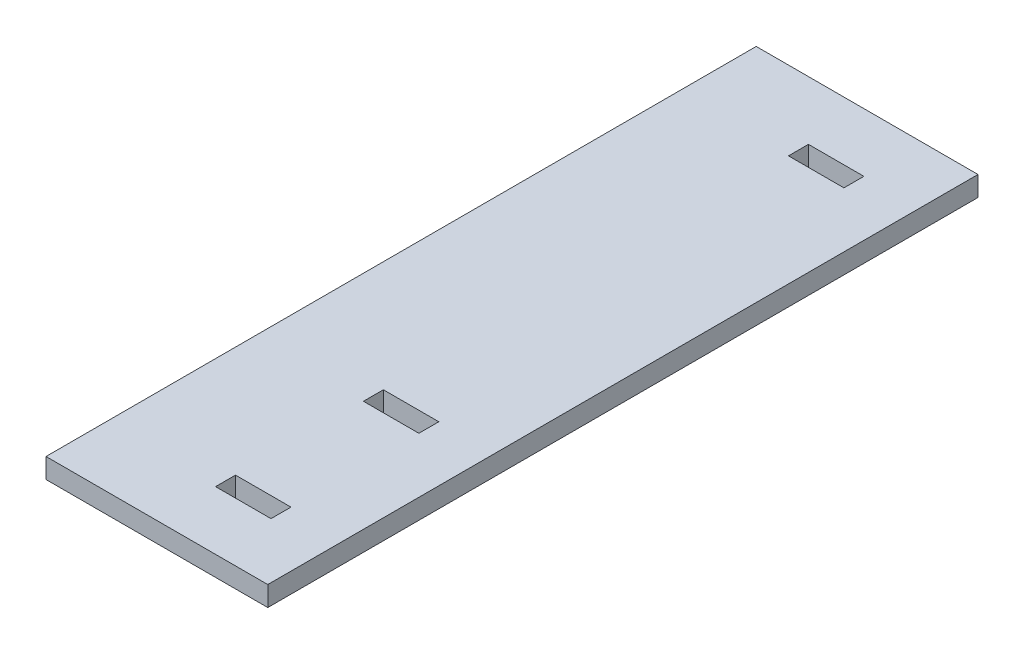
ISO-10303-21;
HEADER;
FILE_DESCRIPTION(('STEP AP214'),'2;1');
FILE_NAME('part.step','',(''),(''),'','','');
FILE_SCHEMA(('AUTOMOTIVE_DESIGN { 1 0 10303 214 1 1 1 1 }'));
ENDSEC;
DATA;
#1=APPLICATION_CONTEXT('core data for automotive mechanical design processes');
#2=APPLICATION_PROTOCOL_DEFINITION('international standard','automotive_design',2000,#1);
#3=PRODUCT_CONTEXT('',#1,'mechanical');
#4=PRODUCT('Part','Part','',(#3));
#5=PRODUCT_RELATED_PRODUCT_CATEGORY('part','',(#4));
#6=PRODUCT_DEFINITION_FORMATION('','',#4);
#7=PRODUCT_DEFINITION_CONTEXT('part definition',#1,'design');
#8=PRODUCT_DEFINITION('design','',#6,#7);
#9=PRODUCT_DEFINITION_SHAPE('','',#8);
#10=(LENGTH_UNIT() NAMED_UNIT(*) SI_UNIT(.MILLI.,.METRE.));
#11=(NAMED_UNIT(*) PLANE_ANGLE_UNIT() SI_UNIT($,.RADIAN.));
#12=(NAMED_UNIT(*) SI_UNIT($,.STERADIAN.) SOLID_ANGLE_UNIT());
#13=UNCERTAINTY_MEASURE_WITH_UNIT(LENGTH_MEASURE(1.E-05),#10,'distance_accuracy_value','');
#14=(GEOMETRIC_REPRESENTATION_CONTEXT(3) GLOBAL_UNCERTAINTY_ASSIGNED_CONTEXT((#13)) GLOBAL_UNIT_ASSIGNED_CONTEXT((#10,
#11,#12)) REPRESENTATION_CONTEXT('',''));
#15=CARTESIAN_POINT('',(0.,0.,0.));
#16=DIRECTION('',(0.,0.,1.));
#17=DIRECTION('',(1.,0.,0.));
#18=AXIS2_PLACEMENT_3D('',#15,#16,#17);
#19=CARTESIAN_POINT('',(-60.,2.7,-66.7875));
#20=DIRECTION('',(0.,-1.,0.));
#21=DIRECTION('',(0.,0.,-1.));
#22=AXIS2_PLACEMENT_3D('',#19,#20,#21);
#23=PLANE('',#22);
#24=DIRECTION('',(0.,0.,-1.));
#25=VECTOR('',#24,1.);
#26=CARTESIAN_POINT('',(-37.5,2.7,-56.15));
#27=LINE('',#26,#25);
#28=CARTESIAN_POINT('',(-37.5,2.7,-56.15));
#29=VERTEX_POINT('',#28);
#30=CARTESIAN_POINT('',(-37.5,2.7,-58.85));
#31=VERTEX_POINT('',#30);
#32=EDGE_CURVE('E182',#29,#31,#27,.T.);
#33=ORIENTED_EDGE('',*,*,#32,.F.);
#34=DIRECTION('',(1.,0.,0.));
#35=VECTOR('',#34,1.);
#36=CARTESIAN_POINT('',(-37.5,2.7,-56.15));
#37=LINE('',#36,#35);
#38=CARTESIAN_POINT('',(-45.,2.7,-56.15));
#39=VERTEX_POINT('',#38);
#40=EDGE_CURVE('E190',#39,#29,#37,.T.);
#41=ORIENTED_EDGE('',*,*,#40,.F.);
#42=DIRECTION('',(0.,0.,1.));
#43=VECTOR('',#42,1.);
#44=CARTESIAN_POINT('',(-45.,2.7,-56.15));
#45=LINE('',#44,#43);
#46=CARTESIAN_POINT('',(-45.,2.7,-58.85));
#47=VERTEX_POINT('',#46);
#48=EDGE_CURVE('E187',#47,#39,#45,.T.);
#49=ORIENTED_EDGE('',*,*,#48,.F.);
#50=DIRECTION('',(-1.,0.,0.));
#51=VECTOR('',#50,1.);
#52=CARTESIAN_POINT('',(-37.5,2.7,-58.85));
#53=LINE('',#52,#51);
#54=EDGE_CURVE('E184',#31,#47,#53,.T.);
#55=ORIENTED_EDGE('',*,*,#54,.F.);
#56=EDGE_LOOP('',(#33,#41,#49,#55));
#57=FACE_BOUND('',#56,.T.);
#58=DIRECTION('',(0.,0.,1.));
#59=VECTOR('',#58,1.);
#60=CARTESIAN_POINT('',(-60.,2.7,29.2875));
#61=LINE('',#60,#59);
#62=CARTESIAN_POINT('',(-60.,2.7,-66.7875));
#63=VERTEX_POINT('',#62);
#64=CARTESIAN_POINT('',(-60.,2.7,29.2875));
#65=VERTEX_POINT('',#64);
#66=EDGE_CURVE('E244',#63,#65,#61,.T.);
#67=ORIENTED_EDGE('',*,*,#66,.T.);
#68=DIRECTION('',(1.,0.,0.));
#69=VECTOR('',#68,1.);
#70=CARTESIAN_POINT('',(-60.,2.7,29.2875));
#71=LINE('',#70,#69);
#72=CARTESIAN_POINT('',(-29.9999999999999,2.7,29.2875));
#73=VERTEX_POINT('',#72);
#74=EDGE_CURVE('E247',#65,#73,#71,.T.);
#75=ORIENTED_EDGE('',*,*,#74,.T.);
#76=DIRECTION('',(0.,0.,-1.));
#77=VECTOR('',#76,1.);
#78=CARTESIAN_POINT('',(-29.9999999999999,2.7,-66.7875));
#79=LINE('',#78,#77);
#80=CARTESIAN_POINT('',(-29.9999999999999,2.7,-66.7875));
#81=VERTEX_POINT('',#80);
#82=EDGE_CURVE('E250',#73,#81,#79,.T.);
#83=ORIENTED_EDGE('',*,*,#82,.T.);
#84=DIRECTION('',(-1.,0.,0.));
#85=VECTOR('',#84,1.);
#86=CARTESIAN_POINT('',(-60.,2.7,-66.7875));
#87=LINE('',#86,#85);
#88=EDGE_CURVE('E252',#81,#63,#87,.T.);
#89=ORIENTED_EDGE('',*,*,#88,.T.);
#90=EDGE_LOOP('',(#67,#75,#83,#89));
#91=FACE_BOUND('',#90,.T.);
#92=DIRECTION('',(0.,0.,-1.));
#93=VECTOR('',#92,1.);
#94=CARTESIAN_POINT('',(-37.5,2.7,-1.35));
#95=LINE('',#94,#93);
#96=CARTESIAN_POINT('',(-37.5,2.7,1.35));
#97=VERTEX_POINT('',#96);
#98=CARTESIAN_POINT('',(-37.5,2.7,-1.35));
#99=VERTEX_POINT('',#98);
#100=EDGE_CURVE('E213',#97,#99,#95,.T.);
#101=ORIENTED_EDGE('',*,*,#100,.F.);
#102=DIRECTION('',(1.,0.,0.));
#103=VECTOR('',#102,1.);
#104=CARTESIAN_POINT('',(-37.5,2.7,1.35));
#105=LINE('',#104,#103);
#106=CARTESIAN_POINT('',(-45.,2.7,1.35000000000001));
#107=VERTEX_POINT('',#106);
#108=EDGE_CURVE('E221',#107,#97,#105,.T.);
#109=ORIENTED_EDGE('',*,*,#108,.F.);
#110=DIRECTION('',(0.,0.,1.));
#111=VECTOR('',#110,1.);
#112=CARTESIAN_POINT('',(-45.,2.7,-1.35));
#113=LINE('',#112,#111);
#114=CARTESIAN_POINT('',(-45.,2.7,-1.35));
#115=VERTEX_POINT('',#114);
#116=EDGE_CURVE('E218',#115,#107,#113,.T.);
#117=ORIENTED_EDGE('',*,*,#116,.F.);
#118=DIRECTION('',(-1.,0.,0.));
#119=VECTOR('',#118,1.);
#120=CARTESIAN_POINT('',(-37.5,2.7,-1.35));
#121=LINE('',#120,#119);
#122=EDGE_CURVE('E215',#99,#115,#121,.T.);
#123=ORIENTED_EDGE('',*,*,#122,.F.);
#124=EDGE_LOOP('',(#101,#109,#117,#123));
#125=FACE_BOUND('',#124,.T.);
#126=DIRECTION('',(0.,0.,-1.));
#127=VECTOR('',#126,1.);
#128=CARTESIAN_POINT('',(-37.5,2.7,18.65));
#129=LINE('',#128,#127);
#130=CARTESIAN_POINT('',(-37.5,2.7,21.35));
#131=VERTEX_POINT('',#130);
#132=CARTESIAN_POINT('',(-37.5,2.7,18.65));
#133=VERTEX_POINT('',#132);
#134=EDGE_CURVE('E146',#131,#133,#129,.T.);
#135=ORIENTED_EDGE('',*,*,#134,.F.);
#136=DIRECTION('',(1.,0.,0.));
#137=VECTOR('',#136,1.);
#138=CARTESIAN_POINT('',(-37.5,2.7,21.35));
#139=LINE('',#138,#137);
#140=CARTESIAN_POINT('',(-45.,2.7,21.35));
#141=VERTEX_POINT('',#140);
#142=EDGE_CURVE('E168',#141,#131,#139,.T.);
#143=ORIENTED_EDGE('',*,*,#142,.F.);
#144=DIRECTION('',(0.,0.,1.));
#145=VECTOR('',#144,1.);
#146=CARTESIAN_POINT('',(-45.,2.7,18.65));
#147=LINE('',#146,#145);
#148=CARTESIAN_POINT('',(-45.,2.7,18.65));
#149=VERTEX_POINT('',#148);
#150=EDGE_CURVE('E166',#149,#141,#147,.T.);
#151=ORIENTED_EDGE('',*,*,#150,.F.);
#152=DIRECTION('',(-1.,0.,0.));
#153=VECTOR('',#152,1.);
#154=CARTESIAN_POINT('',(-37.5,2.7,18.65));
#155=LINE('',#154,#153);
#156=EDGE_CURVE('E154',#133,#149,#155,.T.);
#157=ORIENTED_EDGE('',*,*,#156,.F.);
#158=EDGE_LOOP('',(#135,#143,#151,#157));
#159=FACE_BOUND('',#158,.T.);
#160=ADVANCED_FACE('F33',(#57,#91,#125,#159),#23,.F.);
#161=CARTESIAN_POINT('',(-60.,0.,-66.7875));
#162=DIRECTION('',(0.,-1.,0.));
#163=DIRECTION('',(0.,0.,-1.));
#164=AXIS2_PLACEMENT_3D('',#161,#162,#163);
#165=PLANE('',#164);
#166=DIRECTION('',(1.,0.,0.));
#167=VECTOR('',#166,1.);
#168=CARTESIAN_POINT('',(-37.5,0.,-56.15));
#169=LINE('',#168,#167);
#170=CARTESIAN_POINT('',(-45.,0.,-56.15));
#171=VERTEX_POINT('',#170);
#172=CARTESIAN_POINT('',(-37.5,0.,-56.15));
#173=VERTEX_POINT('',#172);
#174=EDGE_CURVE('E185',#171,#173,#169,.T.);
#175=ORIENTED_EDGE('',*,*,#174,.T.);
#176=DIRECTION('',(0.,0.,-1.));
#177=VECTOR('',#176,1.);
#178=CARTESIAN_POINT('',(-37.5,0.,-56.15));
#179=LINE('',#178,#177);
#180=CARTESIAN_POINT('',(-37.5,0.,-58.85));
#181=VERTEX_POINT('',#180);
#182=EDGE_CURVE('E162',#173,#181,#179,.T.);
#183=ORIENTED_EDGE('',*,*,#182,.T.);
#184=DIRECTION('',(-1.,0.,0.));
#185=VECTOR('',#184,1.);
#186=CARTESIAN_POINT('',(-37.5,0.,-58.85));
#187=LINE('',#186,#185);
#188=CARTESIAN_POINT('',(-45.,0.,-58.85));
#189=VERTEX_POINT('',#188);
#190=EDGE_CURVE('E195',#181,#189,#187,.T.);
#191=ORIENTED_EDGE('',*,*,#190,.T.);
#192=DIRECTION('',(0.,0.,1.));
#193=VECTOR('',#192,1.);
#194=CARTESIAN_POINT('',(-45.,0.,-56.15));
#195=LINE('',#194,#193);
#196=EDGE_CURVE('E198',#189,#171,#195,.T.);
#197=ORIENTED_EDGE('',*,*,#196,.T.);
#198=EDGE_LOOP('',(#175,#183,#191,#197));
#199=FACE_BOUND('',#198,.T.);
#200=DIRECTION('',(0.,0.,1.));
#201=VECTOR('',#200,1.);
#202=CARTESIAN_POINT('',(-60.,0.,29.2875));
#203=LINE('',#202,#201);
#204=CARTESIAN_POINT('',(-60.,0.,-66.7875));
#205=VERTEX_POINT('',#204);
#206=CARTESIAN_POINT('',(-60.,0.,29.2875));
#207=VERTEX_POINT('',#206);
#208=EDGE_CURVE('E243',#205,#207,#203,.T.);
#209=ORIENTED_EDGE('',*,*,#208,.F.);
#210=DIRECTION('',(-1.,0.,0.));
#211=VECTOR('',#210,1.);
#212=CARTESIAN_POINT('',(-60.,0.,-66.7875));
#213=LINE('',#212,#211);
#214=CARTESIAN_POINT('',(-29.9999999999999,0.,-66.7875));
#215=VERTEX_POINT('',#214);
#216=EDGE_CURVE('E248',#215,#205,#213,.T.);
#217=ORIENTED_EDGE('',*,*,#216,.F.);
#218=DIRECTION('',(0.,0.,-1.));
#219=VECTOR('',#218,1.);
#220=CARTESIAN_POINT('',(-29.9999999999999,0.,-66.7875));
#221=LINE('',#220,#219);
#222=CARTESIAN_POINT('',(-29.9999999999999,0.,29.2875));
#223=VERTEX_POINT('',#222);
#224=EDGE_CURVE('E259',#223,#215,#221,.T.);
#225=ORIENTED_EDGE('',*,*,#224,.F.);
#226=DIRECTION('',(1.,0.,0.));
#227=VECTOR('',#226,1.);
#228=CARTESIAN_POINT('',(-60.,0.,29.2875));
#229=LINE('',#228,#227);
#230=EDGE_CURVE('E257',#207,#223,#229,.T.);
#231=ORIENTED_EDGE('',*,*,#230,.F.);
#232=EDGE_LOOP('',(#209,#217,#225,#231));
#233=FACE_BOUND('',#232,.T.);
#234=DIRECTION('',(1.,0.,0.));
#235=VECTOR('',#234,1.);
#236=CARTESIAN_POINT('',(-37.5,0.,1.35));
#237=LINE('',#236,#235);
#238=CARTESIAN_POINT('',(-45.,0.,1.35));
#239=VERTEX_POINT('',#238);
#240=CARTESIAN_POINT('',(-37.5,0.,1.35000000000001));
#241=VERTEX_POINT('',#240);
#242=EDGE_CURVE('E216',#239,#241,#237,.T.);
#243=ORIENTED_EDGE('',*,*,#242,.T.);
#244=DIRECTION('',(0.,0.,-1.));
#245=VECTOR('',#244,1.);
#246=CARTESIAN_POINT('',(-37.5,0.,-1.35));
#247=LINE('',#246,#245);
#248=CARTESIAN_POINT('',(-37.5,0.,-1.35));
#249=VERTEX_POINT('',#248);
#250=EDGE_CURVE('E212',#241,#249,#247,.T.);
#251=ORIENTED_EDGE('',*,*,#250,.T.);
#252=DIRECTION('',(-1.,0.,0.));
#253=VECTOR('',#252,1.);
#254=CARTESIAN_POINT('',(-37.5,0.,-1.35));
#255=LINE('',#254,#253);
#256=CARTESIAN_POINT('',(-45.,0.,-1.35));
#257=VERTEX_POINT('',#256);
#258=EDGE_CURVE('E226',#249,#257,#255,.T.);
#259=ORIENTED_EDGE('',*,*,#258,.T.);
#260=DIRECTION('',(0.,0.,1.));
#261=VECTOR('',#260,1.);
#262=CARTESIAN_POINT('',(-45.,0.,-1.35));
#263=LINE('',#262,#261);
#264=EDGE_CURVE('E229',#257,#239,#263,.T.);
#265=ORIENTED_EDGE('',*,*,#264,.T.);
#266=EDGE_LOOP('',(#243,#251,#259,#265));
#267=FACE_BOUND('',#266,.T.);
#268=DIRECTION('',(1.,0.,0.));
#269=VECTOR('',#268,1.);
#270=CARTESIAN_POINT('',(-37.5,0.,21.35));
#271=LINE('',#270,#269);
#272=CARTESIAN_POINT('',(-45.,0.,21.35));
#273=VERTEX_POINT('',#272);
#274=CARTESIAN_POINT('',(-37.5,0.,21.35));
#275=VERTEX_POINT('',#274);
#276=EDGE_CURVE('E155',#273,#275,#271,.T.);
#277=ORIENTED_EDGE('',*,*,#276,.T.);
#278=DIRECTION('',(0.,0.,-1.));
#279=VECTOR('',#278,1.);
#280=CARTESIAN_POINT('',(-37.5,0.,18.65));
#281=LINE('',#280,#279);
#282=CARTESIAN_POINT('',(-37.5,0.,18.65));
#283=VERTEX_POINT('',#282);
#284=EDGE_CURVE('E56',#275,#283,#281,.T.);
#285=ORIENTED_EDGE('',*,*,#284,.T.);
#286=DIRECTION('',(-1.,0.,0.));
#287=VECTOR('',#286,1.);
#288=CARTESIAN_POINT('',(-37.5,0.,18.65));
#289=LINE('',#288,#287);
#290=CARTESIAN_POINT('',(-45.,0.,18.65));
#291=VERTEX_POINT('',#290);
#292=EDGE_CURVE('E161',#283,#291,#289,.T.);
#293=ORIENTED_EDGE('',*,*,#292,.T.);
#294=DIRECTION('',(0.,0.,1.));
#295=VECTOR('',#294,1.);
#296=CARTESIAN_POINT('',(-45.,0.,18.65));
#297=LINE('',#296,#295);
#298=EDGE_CURVE('E174',#291,#273,#297,.T.);
#299=ORIENTED_EDGE('',*,*,#298,.T.);
#300=EDGE_LOOP('',(#277,#285,#293,#299));
#301=FACE_BOUND('',#300,.T.);
#302=ADVANCED_FACE('F277',(#199,#233,#267,#301),#165,.T.);
#303=CARTESIAN_POINT('',(-60.,2.7,29.2875));
#304=DIRECTION('',(1.,0.,0.));
#305=DIRECTION('',(0.,0.,-1.));
#306=AXIS2_PLACEMENT_3D('',#303,#304,#305);
#307=PLANE('',#306);
#308=ORIENTED_EDGE('',*,*,#208,.T.);
#309=DIRECTION('',(0.,-1.,0.));
#310=VECTOR('',#309,1.);
#311=CARTESIAN_POINT('',(-60.,2.7,29.2875));
#312=LINE('',#311,#310);
#313=EDGE_CURVE('E11',#65,#207,#312,.T.);
#314=ORIENTED_EDGE('',*,*,#313,.F.);
#315=ORIENTED_EDGE('',*,*,#66,.F.);
#316=DIRECTION('',(0.,-1.,0.));
#317=VECTOR('',#316,1.);
#318=CARTESIAN_POINT('',(-60.,2.7,-66.7875));
#319=LINE('',#318,#317);
#320=EDGE_CURVE('E254',#63,#205,#319,.T.);
#321=ORIENTED_EDGE('',*,*,#320,.T.);
#322=EDGE_LOOP('',(#308,#314,#315,#321));
#323=FACE_BOUND('',#322,.T.);
#324=ADVANCED_FACE('F35',(#323),#307,.F.);
#325=CARTESIAN_POINT('',(-60.,2.7,29.2875));
#326=DIRECTION('',(0.,0.,-1.));
#327=DIRECTION('',(-1.,0.,0.));
#328=AXIS2_PLACEMENT_3D('',#325,#326,#327);
#329=PLANE('',#328);
#330=ORIENTED_EDGE('',*,*,#230,.T.);
#331=DIRECTION('',(0.,-1.,0.));
#332=VECTOR('',#331,1.);
#333=CARTESIAN_POINT('',(-29.9999999999999,2.7,29.2875));
#334=LINE('',#333,#332);
#335=EDGE_CURVE('E41',#73,#223,#334,.T.);
#336=ORIENTED_EDGE('',*,*,#335,.F.);
#337=ORIENTED_EDGE('',*,*,#74,.F.);
#338=ORIENTED_EDGE('',*,*,#313,.T.);
#339=EDGE_LOOP('',(#330,#336,#337,#338));
#340=FACE_BOUND('',#339,.T.);
#341=ADVANCED_FACE('F288',(#340),#329,.F.);
#342=CARTESIAN_POINT('',(-29.9999999999999,2.7,-66.7875));
#343=DIRECTION('',(-1.,0.,0.));
#344=DIRECTION('',(0.,0.,1.));
#345=AXIS2_PLACEMENT_3D('',#342,#343,#344);
#346=PLANE('',#345);
#347=ORIENTED_EDGE('',*,*,#224,.T.);
#348=DIRECTION('',(0.,-1.,0.));
#349=VECTOR('',#348,1.);
#350=CARTESIAN_POINT('',(-29.9999999999999,2.7,-66.7875));
#351=LINE('',#350,#349);
#352=EDGE_CURVE('E264',#81,#215,#351,.T.);
#353=ORIENTED_EDGE('',*,*,#352,.F.);
#354=ORIENTED_EDGE('',*,*,#82,.F.);
#355=ORIENTED_EDGE('',*,*,#335,.T.);
#356=EDGE_LOOP('',(#347,#353,#354,#355));
#357=FACE_BOUND('',#356,.T.);
#358=ADVANCED_FACE('F271',(#357),#346,.F.);
#359=CARTESIAN_POINT('',(-60.,2.7,-66.7875));
#360=DIRECTION('',(0.,0.,1.));
#361=DIRECTION('',(1.,0.,0.));
#362=AXIS2_PLACEMENT_3D('',#359,#360,#361);
#363=PLANE('',#362);
#364=ORIENTED_EDGE('',*,*,#216,.T.);
#365=ORIENTED_EDGE('',*,*,#320,.F.);
#366=ORIENTED_EDGE('',*,*,#88,.F.);
#367=ORIENTED_EDGE('',*,*,#352,.T.);
#368=EDGE_LOOP('',(#364,#365,#366,#367));
#369=FACE_BOUND('',#368,.T.);
#370=ADVANCED_FACE('F281',(#369),#363,.F.);
#371=CARTESIAN_POINT('',(-37.5,2.7,-1.35));
#372=DIRECTION('',(-1.,0.,0.));
#373=DIRECTION('',(0.,0.,1.));
#374=AXIS2_PLACEMENT_3D('',#371,#372,#373);
#375=PLANE('',#374);
#376=ORIENTED_EDGE('',*,*,#250,.F.);
#377=DIRECTION('',(0.,-1.,0.));
#378=VECTOR('',#377,1.);
#379=CARTESIAN_POINT('',(-37.5,2.7,1.35));
#380=LINE('',#379,#378);
#381=EDGE_CURVE('E223',#97,#241,#380,.T.);
#382=ORIENTED_EDGE('',*,*,#381,.F.);
#383=ORIENTED_EDGE('',*,*,#100,.T.);
#384=DIRECTION('',(0.,-1.,0.));
#385=VECTOR('',#384,1.);
#386=CARTESIAN_POINT('',(-37.5,2.7,-1.35));
#387=LINE('',#386,#385);
#388=EDGE_CURVE('E240',#99,#249,#387,.T.);
#389=ORIENTED_EDGE('',*,*,#388,.T.);
#390=EDGE_LOOP('',(#376,#382,#383,#389));
#391=FACE_BOUND('',#390,.T.);
#392=ADVANCED_FACE('F305',(#391),#375,.T.);
#393=CARTESIAN_POINT('',(-37.5,2.7,-1.35));
#394=DIRECTION('',(0.,0.,1.));
#395=DIRECTION('',(1.,0.,0.));
#396=AXIS2_PLACEMENT_3D('',#393,#394,#395);
#397=PLANE('',#396);
#398=ORIENTED_EDGE('',*,*,#258,.F.);
#399=ORIENTED_EDGE('',*,*,#388,.F.);
#400=ORIENTED_EDGE('',*,*,#122,.T.);
#401=DIRECTION('',(0.,-1.,0.));
#402=VECTOR('',#401,1.);
#403=CARTESIAN_POINT('',(-45.,2.7,-1.35));
#404=LINE('',#403,#402);
#405=EDGE_CURVE('E238',#115,#257,#404,.T.);
#406=ORIENTED_EDGE('',*,*,#405,.T.);
#407=EDGE_LOOP('',(#398,#399,#400,#406));
#408=FACE_BOUND('',#407,.T.);
#409=ADVANCED_FACE('F312',(#408),#397,.T.);
#410=CARTESIAN_POINT('',(-45.,2.7,-1.35));
#411=DIRECTION('',(1.,0.,0.));
#412=DIRECTION('',(0.,0.,-1.));
#413=AXIS2_PLACEMENT_3D('',#410,#411,#412);
#414=PLANE('',#413);
#415=ORIENTED_EDGE('',*,*,#264,.F.);
#416=ORIENTED_EDGE('',*,*,#405,.F.);
#417=ORIENTED_EDGE('',*,*,#116,.T.);
#418=DIRECTION('',(0.,-1.,0.));
#419=VECTOR('',#418,1.);
#420=CARTESIAN_POINT('',(-45.,2.7,1.35));
#421=LINE('',#420,#419);
#422=EDGE_CURVE('E236',#107,#239,#421,.T.);
#423=ORIENTED_EDGE('',*,*,#422,.T.);
#424=EDGE_LOOP('',(#415,#416,#417,#423));
#425=FACE_BOUND('',#424,.T.);
#426=ADVANCED_FACE('F317',(#425),#414,.T.);
#427=CARTESIAN_POINT('',(-37.5,2.7,1.35));
#428=DIRECTION('',(0.,0.,-1.));
#429=DIRECTION('',(-1.,0.,0.));
#430=AXIS2_PLACEMENT_3D('',#427,#428,#429);
#431=PLANE('',#430);
#432=ORIENTED_EDGE('',*,*,#242,.F.);
#433=ORIENTED_EDGE('',*,*,#422,.F.);
#434=ORIENTED_EDGE('',*,*,#108,.T.);
#435=ORIENTED_EDGE('',*,*,#381,.T.);
#436=EDGE_LOOP('',(#432,#433,#434,#435));
#437=FACE_BOUND('',#436,.T.);
#438=ADVANCED_FACE('F324',(#437),#431,.T.);
#439=CARTESIAN_POINT('',(-37.5,2.7,-56.15));
#440=DIRECTION('',(-1.,0.,0.));
#441=DIRECTION('',(0.,0.,1.));
#442=AXIS2_PLACEMENT_3D('',#439,#440,#441);
#443=PLANE('',#442);
#444=ORIENTED_EDGE('',*,*,#182,.F.);
#445=DIRECTION('',(0.,-1.,0.));
#446=VECTOR('',#445,1.);
#447=CARTESIAN_POINT('',(-37.5,2.7,-56.15));
#448=LINE('',#447,#446);
#449=EDGE_CURVE('E192',#29,#173,#448,.T.);
#450=ORIENTED_EDGE('',*,*,#449,.F.);
#451=ORIENTED_EDGE('',*,*,#32,.T.);
#452=DIRECTION('',(0.,-1.,0.));
#453=VECTOR('',#452,1.);
#454=CARTESIAN_POINT('',(-37.5,2.7,-58.85));
#455=LINE('',#454,#453);
#456=EDGE_CURVE('E209',#31,#181,#455,.T.);
#457=ORIENTED_EDGE('',*,*,#456,.T.);
#458=EDGE_LOOP('',(#444,#450,#451,#457));
#459=FACE_BOUND('',#458,.T.);
#460=ADVANCED_FACE('F337',(#459),#443,.T.);
#461=CARTESIAN_POINT('',(-37.5,2.7,-58.85));
#462=DIRECTION('',(0.,0.,1.));
#463=DIRECTION('',(1.,0.,0.));
#464=AXIS2_PLACEMENT_3D('',#461,#462,#463);
#465=PLANE('',#464);
#466=ORIENTED_EDGE('',*,*,#190,.F.);
#467=ORIENTED_EDGE('',*,*,#456,.F.);
#468=ORIENTED_EDGE('',*,*,#54,.T.);
#469=DIRECTION('',(0.,-1.,0.));
#470=VECTOR('',#469,1.);
#471=CARTESIAN_POINT('',(-45.,2.7,-58.85));
#472=LINE('',#471,#470);
#473=EDGE_CURVE('E207',#47,#189,#472,.T.);
#474=ORIENTED_EDGE('',*,*,#473,.T.);
#475=EDGE_LOOP('',(#466,#467,#468,#474));
#476=FACE_BOUND('',#475,.T.);
#477=ADVANCED_FACE('F342',(#476),#465,.T.);
#478=CARTESIAN_POINT('',(-45.,2.7,-56.15));
#479=DIRECTION('',(1.,0.,0.));
#480=DIRECTION('',(0.,0.,-1.));
#481=AXIS2_PLACEMENT_3D('',#478,#479,#480);
#482=PLANE('',#481);
#483=ORIENTED_EDGE('',*,*,#196,.F.);
#484=ORIENTED_EDGE('',*,*,#473,.F.);
#485=ORIENTED_EDGE('',*,*,#48,.T.);
#486=DIRECTION('',(0.,-1.,0.));
#487=VECTOR('',#486,1.);
#488=CARTESIAN_POINT('',(-45.,2.7,-56.15));
#489=LINE('',#488,#487);
#490=EDGE_CURVE('E205',#39,#171,#489,.T.);
#491=ORIENTED_EDGE('',*,*,#490,.T.);
#492=EDGE_LOOP('',(#483,#484,#485,#491));
#493=FACE_BOUND('',#492,.T.);
#494=ADVANCED_FACE('F346',(#493),#482,.T.);
#495=CARTESIAN_POINT('',(-37.5,2.7,-56.15));
#496=DIRECTION('',(0.,0.,-1.));
#497=DIRECTION('',(-1.,0.,0.));
#498=AXIS2_PLACEMENT_3D('',#495,#496,#497);
#499=PLANE('',#498);
#500=ORIENTED_EDGE('',*,*,#174,.F.);
#501=ORIENTED_EDGE('',*,*,#490,.F.);
#502=ORIENTED_EDGE('',*,*,#40,.T.);
#503=ORIENTED_EDGE('',*,*,#449,.T.);
#504=EDGE_LOOP('',(#500,#501,#502,#503));
#505=FACE_BOUND('',#504,.T.);
#506=ADVANCED_FACE('F350',(#505),#499,.T.);
#507=CARTESIAN_POINT('',(-37.5,2.7,18.65));
#508=DIRECTION('',(-1.,0.,0.));
#509=DIRECTION('',(0.,0.,1.));
#510=AXIS2_PLACEMENT_3D('',#507,#508,#509);
#511=PLANE('',#510);
#512=ORIENTED_EDGE('',*,*,#284,.F.);
#513=DIRECTION('',(0.,-1.,0.));
#514=VECTOR('',#513,1.);
#515=CARTESIAN_POINT('',(-37.5,2.7,21.35));
#516=LINE('',#515,#514);
#517=EDGE_CURVE('E150',#131,#275,#516,.T.);
#518=ORIENTED_EDGE('',*,*,#517,.F.);
#519=ORIENTED_EDGE('',*,*,#134,.T.);
#520=DIRECTION('',(0.,-1.,0.));
#521=VECTOR('',#520,1.);
#522=CARTESIAN_POINT('',(-37.5,2.7,18.65));
#523=LINE('',#522,#521);
#524=EDGE_CURVE('E149',#133,#283,#523,.T.);
#525=ORIENTED_EDGE('',*,*,#524,.T.);
#526=EDGE_LOOP('',(#512,#518,#519,#525));
#527=FACE_BOUND('',#526,.T.);
#528=ADVANCED_FACE('F148',(#527),#511,.T.);
#529=CARTESIAN_POINT('',(-37.5,2.7,18.65));
#530=DIRECTION('',(0.,0.,1.));
#531=DIRECTION('',(1.,0.,0.));
#532=AXIS2_PLACEMENT_3D('',#529,#530,#531);
#533=PLANE('',#532);
#534=ORIENTED_EDGE('',*,*,#292,.F.);
#535=ORIENTED_EDGE('',*,*,#524,.F.);
#536=ORIENTED_EDGE('',*,*,#156,.T.);
#537=DIRECTION('',(0.,-1.,0.));
#538=VECTOR('',#537,1.);
#539=CARTESIAN_POINT('',(-45.,2.7,18.65));
#540=LINE('',#539,#538);
#541=EDGE_CURVE('E163',#149,#291,#540,.T.);
#542=ORIENTED_EDGE('',*,*,#541,.T.);
#543=EDGE_LOOP('',(#534,#535,#536,#542));
#544=FACE_BOUND('',#543,.T.);
#545=ADVANCED_FACE('F158',(#544),#533,.T.);
#546=CARTESIAN_POINT('',(-45.,2.7,18.65));
#547=DIRECTION('',(1.,0.,0.));
#548=DIRECTION('',(0.,0.,-1.));
#549=AXIS2_PLACEMENT_3D('',#546,#547,#548);
#550=PLANE('',#549);
#551=ORIENTED_EDGE('',*,*,#298,.F.);
#552=ORIENTED_EDGE('',*,*,#541,.F.);
#553=ORIENTED_EDGE('',*,*,#150,.T.);
#554=DIRECTION('',(0.,-1.,0.));
#555=VECTOR('',#554,1.);
#556=CARTESIAN_POINT('',(-45.,2.7,21.35));
#557=LINE('',#556,#555);
#558=EDGE_CURVE('E48',#141,#273,#557,.T.);
#559=ORIENTED_EDGE('',*,*,#558,.T.);
#560=EDGE_LOOP('',(#551,#552,#553,#559));
#561=FACE_BOUND('',#560,.T.);
#562=ADVANCED_FACE('F359',(#561),#550,.T.);
#563=CARTESIAN_POINT('',(-37.5,2.7,21.35));
#564=DIRECTION('',(0.,0.,-1.));
#565=DIRECTION('',(-1.,0.,0.));
#566=AXIS2_PLACEMENT_3D('',#563,#564,#565);
#567=PLANE('',#566);
#568=ORIENTED_EDGE('',*,*,#276,.F.);
#569=ORIENTED_EDGE('',*,*,#558,.F.);
#570=ORIENTED_EDGE('',*,*,#142,.T.);
#571=ORIENTED_EDGE('',*,*,#517,.T.);
#572=EDGE_LOOP('',(#568,#569,#570,#571));
#573=FACE_BOUND('',#572,.T.);
#574=ADVANCED_FACE('F362',(#573),#567,.T.);
#575=CLOSED_SHELL('',(#160,#302,#324,#341,#358,#370,#392,#409,#426,#438,#460,#477,#494,#506,
#528,#545,#562,#574));
#576=MANIFOLD_SOLID_BREP('B2',#575);
#577=ADVANCED_BREP_SHAPE_REPRESENTATION('',(#18,#576),#14);
#578=SHAPE_DEFINITION_REPRESENTATION(#9,#577);
ENDSEC;
END-ISO-10303-21;
